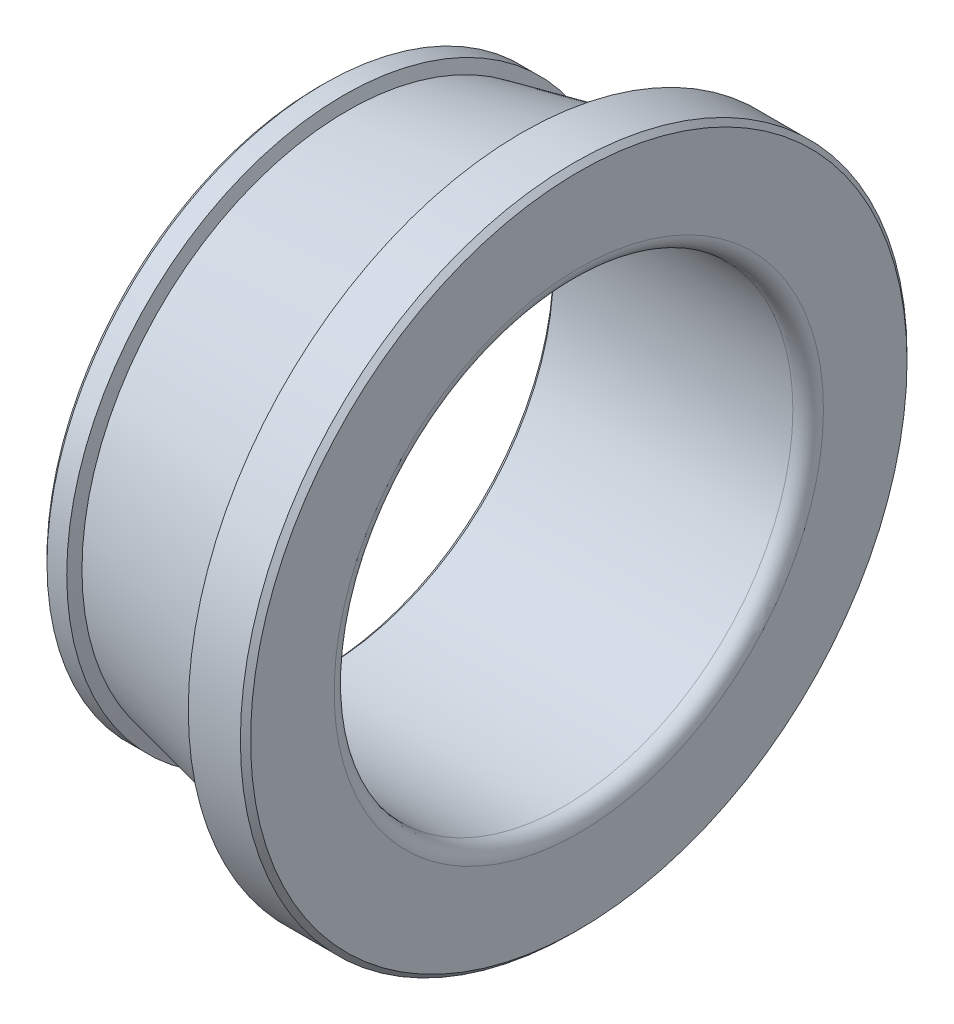
ISO-10303-21;
HEADER;
FILE_DESCRIPTION(('STEP AP214'),'2;1');
FILE_NAME('part.step','',(''),(''),'','','');
FILE_SCHEMA(('AUTOMOTIVE_DESIGN { 1 0 10303 214 1 1 1 1 }'));
ENDSEC;
DATA;
#1=APPLICATION_CONTEXT('core data for automotive mechanical design processes');
#2=APPLICATION_PROTOCOL_DEFINITION('international standard','automotive_design',2000,#1);
#3=PRODUCT_CONTEXT('',#1,'mechanical');
#4=PRODUCT('Part','Part','',(#3));
#5=PRODUCT_RELATED_PRODUCT_CATEGORY('part','',(#4));
#6=PRODUCT_DEFINITION_FORMATION('','',#4);
#7=PRODUCT_DEFINITION_CONTEXT('part definition',#1,'design');
#8=PRODUCT_DEFINITION('design','',#6,#7);
#9=PRODUCT_DEFINITION_SHAPE('','',#8);
#10=(LENGTH_UNIT() NAMED_UNIT(*) SI_UNIT(.MILLI.,.METRE.));
#11=(NAMED_UNIT(*) PLANE_ANGLE_UNIT() SI_UNIT($,.RADIAN.));
#12=(NAMED_UNIT(*) SI_UNIT($,.STERADIAN.) SOLID_ANGLE_UNIT());
#13=UNCERTAINTY_MEASURE_WITH_UNIT(LENGTH_MEASURE(1.E-05),#10,'distance_accuracy_value','');
#14=(GEOMETRIC_REPRESENTATION_CONTEXT(3) GLOBAL_UNCERTAINTY_ASSIGNED_CONTEXT((#13)) GLOBAL_UNIT_ASSIGNED_CONTEXT((#10,
#11,#12)) REPRESENTATION_CONTEXT('',''));
#15=CARTESIAN_POINT('',(0.,0.,0.));
#16=DIRECTION('',(0.,0.,1.));
#17=DIRECTION('',(1.,0.,0.));
#18=AXIS2_PLACEMENT_3D('',#15,#16,#17);
#19=CARTESIAN_POINT('',(0.,17.7811666666667,0.));
#20=DIRECTION('',(-1.,0.,0.));
#21=DIRECTION('',(0.,0.,1.));
#22=AXIS2_PLACEMENT_3D('',#19,#20,#21);
#23=PLANE('',#22);
#24=CARTESIAN_POINT('',(0.,0.,0.));
#25=DIRECTION('',(1.,0.,0.));
#26=DIRECTION('',(0.,0.,-1.));
#27=AXIS2_PLACEMENT_3D('',#24,#25,#26);
#28=CIRCLE('',#27,15.3333333333333);
#29=CARTESIAN_POINT('',(0.,0.,-15.3333333333333));
#30=VERTEX_POINT('',#29);
#31=EDGE_CURVE('E9',#30,#30,#28,.T.);
#32=ORIENTED_EDGE('',*,*,#31,.T.);
#33=EDGE_LOOP('',(#32));
#34=FACE_BOUND('',#33,.T.);
#35=CARTESIAN_POINT('',(0.,0.,0.));
#36=DIRECTION('',(1.,0.,0.));
#37=DIRECTION('',(0.,0.,-1.));
#38=AXIS2_PLACEMENT_3D('',#35,#36,#37);
#39=CIRCLE('',#38,17.7811666666667);
#40=CARTESIAN_POINT('',(0.,0.,-17.7811666666667));
#41=VERTEX_POINT('',#40);
#42=EDGE_CURVE('E54',#41,#41,#39,.T.);
#43=ORIENTED_EDGE('',*,*,#42,.F.);
#44=EDGE_LOOP('',(#43));
#45=FACE_BOUND('',#44,.T.);
#46=ADVANCED_FACE('F14',(#34,#45),#23,.T.);
#47=CARTESIAN_POINT('',(0.,0.,0.));
#48=DIRECTION('',(-1.,0.,0.));
#49=DIRECTION('',(0.,0.,1.));
#50=AXIS2_PLACEMENT_3D('',#47,#48,#49);
#51=CONICAL_SURFACE('',#50,15.3333333333333,0.785398163397448);
#52=CARTESIAN_POINT('',(0.333333333333335,0.,0.));
#53=DIRECTION('',(1.,0.,0.));
#54=DIRECTION('',(0.,0.,-1.));
#55=AXIS2_PLACEMENT_3D('',#52,#53,#54);
#56=CIRCLE('',#55,15.);
#57=CARTESIAN_POINT('',(0.333333333333335,0.,-15.));
#58=VERTEX_POINT('',#57);
#59=EDGE_CURVE('E20',#58,#58,#56,.T.);
#60=ORIENTED_EDGE('',*,*,#59,.T.);
#61=EDGE_LOOP('',(#60));
#62=FACE_BOUND('',#61,.T.);
#63=ORIENTED_EDGE('',*,*,#31,.F.);
#64=EDGE_LOOP('',(#63));
#65=FACE_BOUND('',#64,.T.);
#66=ADVANCED_FACE('F62',(#62,#65),#51,.F.);
#67=CARTESIAN_POINT('',(17.,0.,0.));
#68=DIRECTION('',(1.,0.,0.));
#69=DIRECTION('',(0.,0.,-1.));
#70=AXIS2_PLACEMENT_3D('',#67,#68,#69);
#71=CYLINDRICAL_SURFACE('',#70,15.);
#72=CARTESIAN_POINT('',(16.,0.,0.));
#73=DIRECTION('',(1.,0.,0.));
#74=DIRECTION('',(0.,0.,-1.));
#75=AXIS2_PLACEMENT_3D('',#72,#73,#74);
#76=CIRCLE('',#75,15.);
#77=CARTESIAN_POINT('',(16.,0.,-15.));
#78=VERTEX_POINT('',#77);
#79=EDGE_CURVE('E24',#78,#78,#76,.T.);
#80=ORIENTED_EDGE('',*,*,#79,.T.);
#81=EDGE_LOOP('',(#80));
#82=FACE_BOUND('',#81,.T.);
#83=ORIENTED_EDGE('',*,*,#59,.F.);
#84=EDGE_LOOP('',(#83));
#85=FACE_BOUND('',#84,.T.);
#86=ADVANCED_FACE('F67',(#82,#85),#71,.F.);
#87=CARTESIAN_POINT('',(16.,0.,0.));
#88=DIRECTION('',(1.,0.,0.));
#89=DIRECTION('',(0.,0.,-1.));
#90=AXIS2_PLACEMENT_3D('',#87,#88,#89);
#91=TOROIDAL_SURFACE('',#90,16.,1.00000000000001);
#92=CARTESIAN_POINT('',(17.,0.,0.));
#93=DIRECTION('',(1.,0.,0.));
#94=DIRECTION('',(0.,0.,-1.));
#95=AXIS2_PLACEMENT_3D('',#92,#93,#94);
#96=CIRCLE('',#95,16.);
#97=CARTESIAN_POINT('',(17.,0.,-16.));
#98=VERTEX_POINT('',#97);
#99=EDGE_CURVE('E28',#98,#98,#96,.T.);
#100=ORIENTED_EDGE('',*,*,#99,.T.);
#101=EDGE_LOOP('',(#100));
#102=FACE_BOUND('',#101,.T.);
#103=ORIENTED_EDGE('',*,*,#79,.F.);
#104=EDGE_LOOP('',(#103));
#105=FACE_BOUND('',#104,.T.);
#106=ADVANCED_FACE('F71',(#102,#105),#91,.T.);
#107=CARTESIAN_POINT('',(17.,16.,0.));
#108=DIRECTION('',(1.,0.,0.));
#109=DIRECTION('',(0.,0.,-1.));
#110=AXIS2_PLACEMENT_3D('',#107,#108,#109);
#111=PLANE('',#110);
#112=CARTESIAN_POINT('',(17.,0.,0.));
#113=DIRECTION('',(1.,0.,0.));
#114=DIRECTION('',(0.,0.,-1.));
#115=AXIS2_PLACEMENT_3D('',#112,#113,#114);
#116=CIRCLE('',#115,21.4666666666667);
#117=CARTESIAN_POINT('',(17.,0.,-21.4666666666667));
#118=VERTEX_POINT('',#117);
#119=EDGE_CURVE('E33',#118,#118,#116,.T.);
#120=ORIENTED_EDGE('',*,*,#119,.T.);
#121=EDGE_LOOP('',(#120));
#122=FACE_BOUND('',#121,.T.);
#123=ORIENTED_EDGE('',*,*,#99,.F.);
#124=EDGE_LOOP('',(#123));
#125=FACE_BOUND('',#124,.T.);
#126=ADVANCED_FACE('F78',(#122,#125),#111,.T.);
#127=CARTESIAN_POINT('',(17.,0.,0.));
#128=DIRECTION('',(-1.,0.,0.));
#129=DIRECTION('',(0.,0.,1.));
#130=AXIS2_PLACEMENT_3D('',#127,#128,#129);
#131=CONICAL_SURFACE('',#130,21.4666666666667,0.785398163397448);
#132=CARTESIAN_POINT('',(16.6666666666667,0.,0.));
#133=DIRECTION('',(1.,0.,0.));
#134=DIRECTION('',(0.,0.,-1.));
#135=AXIS2_PLACEMENT_3D('',#132,#133,#134);
#136=CIRCLE('',#135,21.8);
#137=CARTESIAN_POINT('',(16.6666666666667,0.,-21.8));
#138=VERTEX_POINT('',#137);
#139=EDGE_CURVE('E36',#138,#138,#136,.T.);
#140=ORIENTED_EDGE('',*,*,#139,.T.);
#141=EDGE_LOOP('',(#140));
#142=FACE_BOUND('',#141,.T.);
#143=ORIENTED_EDGE('',*,*,#119,.F.);
#144=EDGE_LOOP('',(#143));
#145=FACE_BOUND('',#144,.T.);
#146=ADVANCED_FACE('F82',(#142,#145),#131,.T.);
#147=CARTESIAN_POINT('',(17.,0.,0.));
#148=DIRECTION('',(1.,0.,0.));
#149=DIRECTION('',(0.,0.,-1.));
#150=AXIS2_PLACEMENT_3D('',#147,#148,#149);
#151=CYLINDRICAL_SURFACE('',#150,21.8);
#152=CARTESIAN_POINT('',(13.2597771492138,0.,0.));
#153=DIRECTION('',(1.,0.,0.));
#154=DIRECTION('',(0.,0.,-1.));
#155=AXIS2_PLACEMENT_3D('',#152,#153,#154);
#156=CIRCLE('',#155,21.8);
#157=CARTESIAN_POINT('',(13.2597771492138,0.,-21.8));
#158=VERTEX_POINT('',#157);
#159=EDGE_CURVE('E39',#158,#158,#156,.T.);
#160=ORIENTED_EDGE('',*,*,#159,.T.);
#161=EDGE_LOOP('',(#160));
#162=FACE_BOUND('',#161,.T.);
#163=ORIENTED_EDGE('',*,*,#139,.F.);
#164=EDGE_LOOP('',(#163));
#165=FACE_BOUND('',#164,.T.);
#166=ADVANCED_FACE('F86',(#162,#165),#151,.T.);
#167=CARTESIAN_POINT('',(13.2597771492138,0.,0.));
#168=DIRECTION('',(-1.,0.,0.));
#169=DIRECTION('',(0.,0.,1.));
#170=AXIS2_PLACEMENT_3D('',#167,#168,#169);
#171=CONICAL_SURFACE('',#170,21.8,1.2915436464758);
#172=CARTESIAN_POINT('',(13.7997344613277,0.,0.));
#173=DIRECTION('',(1.,0.,0.));
#174=DIRECTION('',(0.,0.,-1.));
#175=AXIS2_PLACEMENT_3D('',#172,#173,#174);
#176=CIRCLE('',#175,19.9169450706764);
#177=CARTESIAN_POINT('',(13.7997344613277,0.,-19.9169450706764));
#178=VERTEX_POINT('',#177);
#179=EDGE_CURVE('E42',#178,#178,#176,.T.);
#180=ORIENTED_EDGE('',*,*,#179,.T.);
#181=EDGE_LOOP('',(#180));
#182=FACE_BOUND('',#181,.T.);
#183=ORIENTED_EDGE('',*,*,#159,.F.);
#184=EDGE_LOOP('',(#183));
#185=FACE_BOUND('',#184,.T.);
#186=ADVANCED_FACE('F90',(#182,#185),#171,.F.);
#187=CARTESIAN_POINT('',(13.7997344613277,0.,0.));
#188=DIRECTION('',(1.,0.,0.));
#189=DIRECTION('',(0.,0.,-1.));
#190=AXIS2_PLACEMENT_3D('',#187,#188,#189);
#191=CONICAL_SURFACE('',#190,19.9169450706764,0.21235421009015);
#192=CARTESIAN_POINT('',(1.84704101369454,0.,0.));
#193=DIRECTION('',(1.,0.,0.));
#194=DIRECTION('',(0.,0.,-1.));
#195=AXIS2_PLACEMENT_3D('',#192,#193,#194);
#196=CIRCLE('',#195,17.3398864445265);
#197=CARTESIAN_POINT('',(1.84704101369454,0.,-17.3398864445265));
#198=VERTEX_POINT('',#197);
#199=EDGE_CURVE('E45',#198,#198,#196,.T.);
#200=ORIENTED_EDGE('',*,*,#199,.T.);
#201=EDGE_LOOP('',(#200));
#202=FACE_BOUND('',#201,.T.);
#203=ORIENTED_EDGE('',*,*,#179,.F.);
#204=EDGE_LOOP('',(#203));
#205=FACE_BOUND('',#204,.T.);
#206=ADVANCED_FACE('F94',(#202,#205),#191,.T.);
#207=CARTESIAN_POINT('',(1.84704101369454,0.,0.));
#208=DIRECTION('',(-1.,0.,0.));
#209=DIRECTION('',(0.,0.,1.));
#210=AXIS2_PLACEMENT_3D('',#207,#208,#209);
#211=CONICAL_SURFACE('',#210,17.3398864445265,1.2915436464758);
#212=CARTESIAN_POINT('',(1.6249241509163,0.,0.));
#213=DIRECTION('',(1.,0.,0.));
#214=DIRECTION('',(0.,0.,-1.));
#215=AXIS2_PLACEMENT_3D('',#212,#213,#214);
#216=CIRCLE('',#215,18.1145);
#217=CARTESIAN_POINT('',(1.6249241509163,0.,-18.1145));
#218=VERTEX_POINT('',#217);
#219=EDGE_CURVE('E48',#218,#218,#216,.T.);
#220=ORIENTED_EDGE('',*,*,#219,.T.);
#221=EDGE_LOOP('',(#220));
#222=FACE_BOUND('',#221,.T.);
#223=ORIENTED_EDGE('',*,*,#199,.F.);
#224=EDGE_LOOP('',(#223));
#225=FACE_BOUND('',#224,.T.);
#226=ADVANCED_FACE('F98',(#222,#225),#211,.T.);
#227=CARTESIAN_POINT('',(17.,0.,0.));
#228=DIRECTION('',(1.,0.,0.));
#229=DIRECTION('',(0.,0.,-1.));
#230=AXIS2_PLACEMENT_3D('',#227,#228,#229);
#231=CYLINDRICAL_SURFACE('',#230,18.1145);
#232=CARTESIAN_POINT('',(0.333333333333335,0.,0.));
#233=DIRECTION('',(1.,0.,0.));
#234=DIRECTION('',(0.,0.,-1.));
#235=AXIS2_PLACEMENT_3D('',#232,#233,#234);
#236=CIRCLE('',#235,18.1145);
#237=CARTESIAN_POINT('',(0.333333333333335,0.,-18.1145));
#238=VERTEX_POINT('',#237);
#239=EDGE_CURVE('E51',#238,#238,#236,.T.);
#240=ORIENTED_EDGE('',*,*,#239,.T.);
#241=EDGE_LOOP('',(#240));
#242=FACE_BOUND('',#241,.T.);
#243=ORIENTED_EDGE('',*,*,#219,.F.);
#244=EDGE_LOOP('',(#243));
#245=FACE_BOUND('',#244,.T.);
#246=ADVANCED_FACE('F102',(#242,#245),#231,.T.);
#247=CARTESIAN_POINT('',(0.333333333333335,0.,0.));
#248=DIRECTION('',(1.,0.,0.));
#249=DIRECTION('',(0.,0.,-1.));
#250=AXIS2_PLACEMENT_3D('',#247,#248,#249);
#251=CONICAL_SURFACE('',#250,18.1145,0.785398163397443);
#252=ORIENTED_EDGE('',*,*,#42,.T.);
#253=EDGE_LOOP('',(#252));
#254=FACE_BOUND('',#253,.T.);
#255=ORIENTED_EDGE('',*,*,#239,.F.);
#256=EDGE_LOOP('',(#255));
#257=FACE_BOUND('',#256,.T.);
#258=ADVANCED_FACE('F58',(#254,#257),#251,.T.);
#259=CLOSED_SHELL('',(#46,#66,#86,#106,#126,#146,#166,#186,#206,#226,#246,#258));
#260=MANIFOLD_SOLID_BREP('B1',#259);
#261=ADVANCED_BREP_SHAPE_REPRESENTATION('',(#18,#260),#14);
#262=SHAPE_DEFINITION_REPRESENTATION(#9,#261);
ENDSEC;
END-ISO-10303-21;
